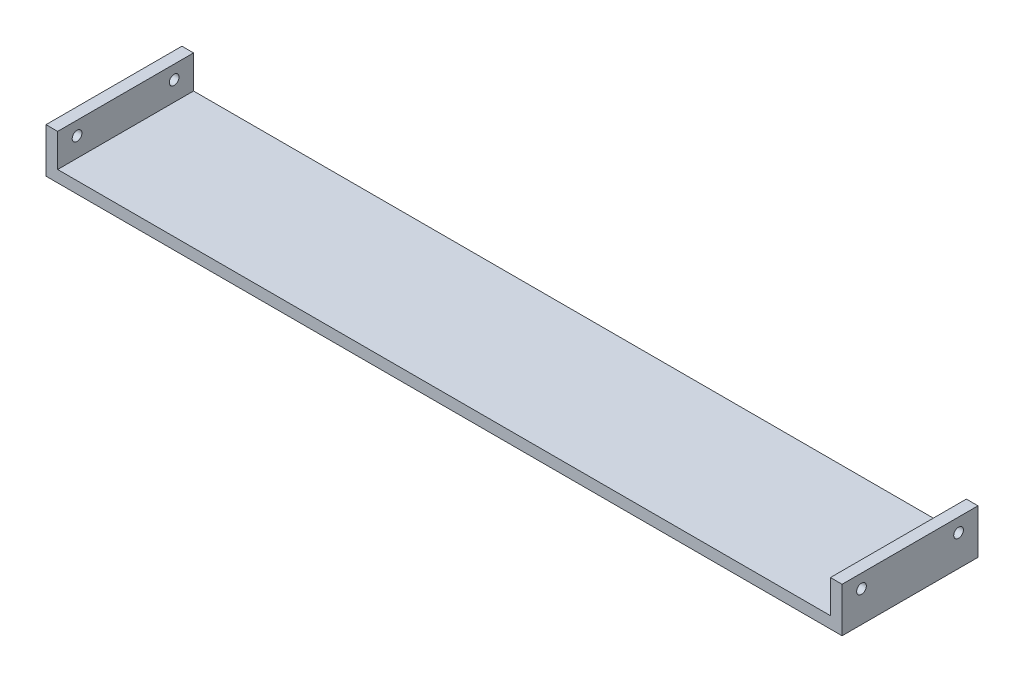
ISO-10303-21;
HEADER;
FILE_DESCRIPTION(('STEP AP214'),'2;1');
FILE_NAME('part.step','',(''),(''),'','','');
FILE_SCHEMA(('AUTOMOTIVE_DESIGN { 1 0 10303 214 1 1 1 1 }'));
ENDSEC;
DATA;
#1=APPLICATION_CONTEXT('core data for automotive mechanical design processes');
#2=APPLICATION_PROTOCOL_DEFINITION('international standard','automotive_design',2000,#1);
#3=PRODUCT_CONTEXT('',#1,'mechanical');
#4=PRODUCT('Part','Part','',(#3));
#5=PRODUCT_RELATED_PRODUCT_CATEGORY('part','',(#4));
#6=PRODUCT_DEFINITION_FORMATION('','',#4);
#7=PRODUCT_DEFINITION_CONTEXT('part definition',#1,'design');
#8=PRODUCT_DEFINITION('design','',#6,#7);
#9=PRODUCT_DEFINITION_SHAPE('','',#8);
#10=(LENGTH_UNIT() NAMED_UNIT(*) SI_UNIT(.MILLI.,.METRE.));
#11=(NAMED_UNIT(*) PLANE_ANGLE_UNIT() SI_UNIT($,.RADIAN.));
#12=(NAMED_UNIT(*) SI_UNIT($,.STERADIAN.) SOLID_ANGLE_UNIT());
#13=UNCERTAINTY_MEASURE_WITH_UNIT(LENGTH_MEASURE(1.E-05),#10,'distance_accuracy_value','');
#14=(GEOMETRIC_REPRESENTATION_CONTEXT(3) GLOBAL_UNCERTAINTY_ASSIGNED_CONTEXT((#13)) GLOBAL_UNIT_ASSIGNED_CONTEXT((#10,
#11,#12)) REPRESENTATION_CONTEXT('',''));
#15=CARTESIAN_POINT('',(0.,0.,0.));
#16=DIRECTION('',(0.,0.,1.));
#17=DIRECTION('',(1.,0.,0.));
#18=AXIS2_PLACEMENT_3D('',#15,#16,#17);
#19=CARTESIAN_POINT('',(0.,6.,0.));
#20=DIRECTION('',(0.,1.,0.));
#21=DIRECTION('',(0.,0.,1.));
#22=AXIS2_PLACEMENT_3D('',#19,#20,#21);
#23=PLANE('',#22);
#24=DIRECTION('',(1.,0.,0.));
#25=VECTOR('',#24,1.);
#26=CARTESIAN_POINT('',(-70.3609605089149,6.,-4.64884917648187));
#27=LINE('',#26,#25);
#28=CARTESIAN_POINT('',(-64.3609605089149,6.,-4.64884917648187));
#29=VERTEX_POINT('',#28);
#30=CARTESIAN_POINT('',(333.639039491085,6.,-4.64884917648187));
#31=VERTEX_POINT('',#30);
#32=EDGE_CURVE('E128',#29,#31,#27,.T.);
#33=ORIENTED_EDGE('',*,*,#32,.T.);
#34=DIRECTION('',(0.,0.,1.));
#35=VECTOR('',#34,1.);
#36=CARTESIAN_POINT('',(333.639039491085,6.,-74.6488491764819));
#37=LINE('',#36,#35);
#38=CARTESIAN_POINT('',(333.639039491085,6.,-74.6488491764819));
#39=VERTEX_POINT('',#38);
#40=EDGE_CURVE('E172',#39,#31,#37,.T.);
#41=ORIENTED_EDGE('',*,*,#40,.F.);
#42=DIRECTION('',(-1.,0.,0.));
#43=VECTOR('',#42,1.);
#44=CARTESIAN_POINT('',(-70.360960508915,6.,-74.6488491764819));
#45=LINE('',#44,#43);
#46=CARTESIAN_POINT('',(-64.3609605089149,6.,-74.6488491764819));
#47=VERTEX_POINT('',#46);
#48=EDGE_CURVE('E132',#39,#47,#45,.T.);
#49=ORIENTED_EDGE('',*,*,#48,.T.);
#50=DIRECTION('',(0.,0.,-1.));
#51=VECTOR('',#50,1.);
#52=CARTESIAN_POINT('',(-64.3609605089149,6.,-4.64884917648187));
#53=LINE('',#52,#51);
#54=EDGE_CURVE('E134',#29,#47,#53,.T.);
#55=ORIENTED_EDGE('',*,*,#54,.F.);
#56=EDGE_LOOP('',(#33,#41,#49,#55));
#57=FACE_BOUND('',#56,.T.);
#58=ADVANCED_FACE('F36',(#57),#23,.T.);
#59=CARTESIAN_POINT('',(-70.360960508915,6.,-74.6488491764819));
#60=DIRECTION('',(1.,0.,0.));
#61=DIRECTION('',(0.,0.,-1.));
#62=AXIS2_PLACEMENT_3D('',#59,#60,#61);
#63=PLANE('',#62);
#64=CARTESIAN_POINT('',(-70.3609605089149,16.,-14.6488491764819));
#65=DIRECTION('',(-1.,0.,0.));
#66=DIRECTION('',(0.,0.,1.));
#67=AXIS2_PLACEMENT_3D('',#64,#65,#66);
#68=CIRCLE('',#67,2.5);
#69=CARTESIAN_POINT('',(-70.3609605089149,16.,-12.1488491764819));
#70=VERTEX_POINT('',#69);
#71=EDGE_CURVE('E185',#70,#70,#68,.T.);
#72=ORIENTED_EDGE('',*,*,#71,.F.);
#73=EDGE_LOOP('',(#72));
#74=FACE_BOUND('',#73,.T.);
#75=CARTESIAN_POINT('',(-70.360960508915,16.,-64.6488491764819));
#76=DIRECTION('',(-1.,0.,0.));
#77=DIRECTION('',(0.,0.,1.));
#78=AXIS2_PLACEMENT_3D('',#75,#76,#77);
#79=CIRCLE('',#78,2.5);
#80=CARTESIAN_POINT('',(-70.360960508915,16.,-62.1488491764819));
#81=VERTEX_POINT('',#80);
#82=EDGE_CURVE('E178',#81,#81,#79,.T.);
#83=ORIENTED_EDGE('',*,*,#82,.F.);
#84=EDGE_LOOP('',(#83));
#85=FACE_BOUND('',#84,.T.);
#86=DIRECTION('',(0.,-1.,0.));
#87=VECTOR('',#86,1.);
#88=CARTESIAN_POINT('',(-70.3609605089149,6.,-4.64884917648187));
#89=LINE('',#88,#87);
#90=CARTESIAN_POINT('',(-70.3609605089149,23.,-4.64884917648187));
#91=VERTEX_POINT('',#90);
#92=CARTESIAN_POINT('',(-70.3609605089149,0.,-4.64884917648187));
#93=VERTEX_POINT('',#92);
#94=EDGE_CURVE('E46',#91,#93,#89,.T.);
#95=ORIENTED_EDGE('',*,*,#94,.F.);
#96=DIRECTION('',(0.,0.,-1.));
#97=VECTOR('',#96,1.);
#98=CARTESIAN_POINT('',(-70.3609605089149,23.,-4.64884917648187));
#99=LINE('',#98,#97);
#100=CARTESIAN_POINT('',(-70.3609605089149,23.,-74.6488491764819));
#101=VERTEX_POINT('',#100);
#102=EDGE_CURVE('E101',#91,#101,#99,.T.);
#103=ORIENTED_EDGE('',*,*,#102,.T.);
#104=DIRECTION('',(0.,-1.,0.));
#105=VECTOR('',#104,1.);
#106=CARTESIAN_POINT('',(-70.360960508915,6.,-74.6488491764819));
#107=LINE('',#106,#105);
#108=CARTESIAN_POINT('',(-70.360960508915,0.,-74.6488491764819));
#109=VERTEX_POINT('',#108);
#110=EDGE_CURVE('E147',#101,#109,#107,.T.);
#111=ORIENTED_EDGE('',*,*,#110,.T.);
#112=DIRECTION('',(0.,0.,1.));
#113=VECTOR('',#112,1.);
#114=CARTESIAN_POINT('',(-70.360960508915,0.,-74.6488491764819));
#115=LINE('',#114,#113);
#116=EDGE_CURVE('E121',#109,#93,#115,.T.);
#117=ORIENTED_EDGE('',*,*,#116,.T.);
#118=EDGE_LOOP('',(#95,#103,#111,#117));
#119=FACE_BOUND('',#118,.T.);
#120=ADVANCED_FACE('F38',(#74,#85,#119),#63,.F.);
#121=CARTESIAN_POINT('',(-70.3609605089149,6.,-4.64884917648187));
#122=DIRECTION('',(0.,0.,-1.));
#123=DIRECTION('',(-1.,0.,0.));
#124=AXIS2_PLACEMENT_3D('',#121,#122,#123);
#125=PLANE('',#124);
#126=DIRECTION('',(0.,-1.,0.));
#127=VECTOR('',#126,1.);
#128=CARTESIAN_POINT('',(339.639039491085,6.,-4.64884917648187));
#129=LINE('',#128,#127);
#130=CARTESIAN_POINT('',(339.639039491085,23.,-4.64884917648187));
#131=VERTEX_POINT('',#130);
#132=CARTESIAN_POINT('',(339.639039491085,0.,-4.64884917648187));
#133=VERTEX_POINT('',#132);
#134=EDGE_CURVE('E122',#131,#133,#129,.T.);
#135=ORIENTED_EDGE('',*,*,#134,.F.);
#136=DIRECTION('',(1.,0.,0.));
#137=VECTOR('',#136,1.);
#138=CARTESIAN_POINT('',(-70.3609605089149,23.,-4.64884917648187));
#139=LINE('',#138,#137);
#140=CARTESIAN_POINT('',(333.639039491085,23.,-4.64884917648187));
#141=VERTEX_POINT('',#140);
#142=EDGE_CURVE('E108',#141,#131,#139,.T.);
#143=ORIENTED_EDGE('',*,*,#142,.F.);
#144=DIRECTION('',(0.,-1.,0.));
#145=VECTOR('',#144,1.);
#146=CARTESIAN_POINT('',(333.639039491085,31.,-4.64884917648187));
#147=LINE('',#146,#145);
#148=EDGE_CURVE('E167',#141,#31,#147,.T.);
#149=ORIENTED_EDGE('',*,*,#148,.T.);
#150=ORIENTED_EDGE('',*,*,#32,.F.);
#151=DIRECTION('',(0.,-1.,0.));
#152=VECTOR('',#151,1.);
#153=CARTESIAN_POINT('',(-64.3609605089149,31.,-4.64884917648187));
#154=LINE('',#153,#152);
#155=CARTESIAN_POINT('',(-64.3609605089149,23.,-4.64884917648187));
#156=VERTEX_POINT('',#155);
#157=EDGE_CURVE('E40',#156,#29,#154,.T.);
#158=ORIENTED_EDGE('',*,*,#157,.F.);
#159=EDGE_CURVE('E54',#91,#156,#139,.T.);
#160=ORIENTED_EDGE('',*,*,#159,.F.);
#161=ORIENTED_EDGE('',*,*,#94,.T.);
#162=DIRECTION('',(1.,0.,0.));
#163=VECTOR('',#162,1.);
#164=CARTESIAN_POINT('',(-70.3609605089149,0.,-4.64884917648187));
#165=LINE('',#164,#163);
#166=EDGE_CURVE('E208',#93,#133,#165,.T.);
#167=ORIENTED_EDGE('',*,*,#166,.T.);
#168=EDGE_LOOP('',(#135,#143,#149,#150,#158,#160,#161,#167));
#169=FACE_BOUND('',#168,.T.);
#170=ADVANCED_FACE('F114',(#169),#125,.F.);
#171=CARTESIAN_POINT('',(339.639039491085,6.,-74.6488491764819));
#172=DIRECTION('',(-1.,0.,0.));
#173=DIRECTION('',(0.,0.,1.));
#174=AXIS2_PLACEMENT_3D('',#171,#172,#173);
#175=PLANE('',#174);
#176=CARTESIAN_POINT('',(339.639039491085,16.,-14.648849176482));
#177=DIRECTION('',(-1.,0.,0.));
#178=DIRECTION('',(0.,0.,1.));
#179=AXIS2_PLACEMENT_3D('',#176,#177,#178);
#180=CIRCLE('',#179,2.5);
#181=CARTESIAN_POINT('',(339.639039491085,16.,-12.148849176482));
#182=VERTEX_POINT('',#181);
#183=EDGE_CURVE('E157',#182,#182,#180,.T.);
#184=ORIENTED_EDGE('',*,*,#183,.T.);
#185=EDGE_LOOP('',(#184));
#186=FACE_BOUND('',#185,.T.);
#187=CARTESIAN_POINT('',(339.639039491085,16.,-64.648849176482));
#188=DIRECTION('',(-1.,0.,0.));
#189=DIRECTION('',(0.,0.,1.));
#190=AXIS2_PLACEMENT_3D('',#187,#188,#189);
#191=CIRCLE('',#190,2.5);
#192=CARTESIAN_POINT('',(339.639039491085,16.,-62.148849176482));
#193=VERTEX_POINT('',#192);
#194=EDGE_CURVE('E153',#193,#193,#191,.T.);
#195=ORIENTED_EDGE('',*,*,#194,.T.);
#196=EDGE_LOOP('',(#195));
#197=FACE_BOUND('',#196,.T.);
#198=DIRECTION('',(0.,-1.,0.));
#199=VECTOR('',#198,1.);
#200=CARTESIAN_POINT('',(339.639039491085,6.,-74.6488491764819));
#201=LINE('',#200,#199);
#202=CARTESIAN_POINT('',(339.639039491085,23.,-74.6488491764819));
#203=VERTEX_POINT('',#202);
#204=CARTESIAN_POINT('',(339.639039491085,0.,-74.6488491764819));
#205=VERTEX_POINT('',#204);
#206=EDGE_CURVE('E124',#203,#205,#201,.T.);
#207=ORIENTED_EDGE('',*,*,#206,.F.);
#208=DIRECTION('',(0.,0.,-1.));
#209=VECTOR('',#208,1.);
#210=CARTESIAN_POINT('',(339.639039491085,23.,-4.64884917648187));
#211=LINE('',#210,#209);
#212=EDGE_CURVE('E109',#131,#203,#211,.T.);
#213=ORIENTED_EDGE('',*,*,#212,.F.);
#214=ORIENTED_EDGE('',*,*,#134,.T.);
#215=DIRECTION('',(0.,0.,-1.));
#216=VECTOR('',#215,1.);
#217=CARTESIAN_POINT('',(339.639039491085,0.,-74.6488491764819));
#218=LINE('',#217,#216);
#219=EDGE_CURVE('E203',#133,#205,#218,.T.);
#220=ORIENTED_EDGE('',*,*,#219,.T.);
#221=EDGE_LOOP('',(#207,#213,#214,#220));
#222=FACE_BOUND('',#221,.T.);
#223=ADVANCED_FACE('F201',(#186,#197,#222),#175,.F.);
#224=CARTESIAN_POINT('',(-70.360960508915,6.,-74.6488491764819));
#225=DIRECTION('',(0.,0.,1.));
#226=DIRECTION('',(1.,0.,0.));
#227=AXIS2_PLACEMENT_3D('',#224,#225,#226);
#228=PLANE('',#227);
#229=ORIENTED_EDGE('',*,*,#110,.F.);
#230=DIRECTION('',(1.,0.,0.));
#231=VECTOR('',#230,1.);
#232=CARTESIAN_POINT('',(-70.3609605089149,23.,-74.6488491764819));
#233=LINE('',#232,#231);
#234=CARTESIAN_POINT('',(-64.3609605089149,23.,-74.6488491764819));
#235=VERTEX_POINT('',#234);
#236=EDGE_CURVE('E104',#101,#235,#233,.T.);
#237=ORIENTED_EDGE('',*,*,#236,.T.);
#238=DIRECTION('',(0.,-1.,0.));
#239=VECTOR('',#238,1.);
#240=CARTESIAN_POINT('',(-64.3609605089149,31.,-74.6488491764819));
#241=LINE('',#240,#239);
#242=EDGE_CURVE('E158',#235,#47,#241,.T.);
#243=ORIENTED_EDGE('',*,*,#242,.T.);
#244=ORIENTED_EDGE('',*,*,#48,.F.);
#245=DIRECTION('',(0.,-1.,0.));
#246=VECTOR('',#245,1.);
#247=CARTESIAN_POINT('',(333.639039491085,31.,-74.6488491764819));
#248=LINE('',#247,#246);
#249=CARTESIAN_POINT('',(333.639039491085,23.,-74.6488491764819));
#250=VERTEX_POINT('',#249);
#251=EDGE_CURVE('E164',#250,#39,#248,.T.);
#252=ORIENTED_EDGE('',*,*,#251,.F.);
#253=EDGE_CURVE('E62',#250,#203,#233,.T.);
#254=ORIENTED_EDGE('',*,*,#253,.T.);
#255=ORIENTED_EDGE('',*,*,#206,.T.);
#256=DIRECTION('',(-1.,0.,0.));
#257=VECTOR('',#256,1.);
#258=CARTESIAN_POINT('',(-70.360960508915,0.,-74.6488491764819));
#259=LINE('',#258,#257);
#260=EDGE_CURVE('E133',#205,#109,#259,.T.);
#261=ORIENTED_EDGE('',*,*,#260,.T.);
#262=EDGE_LOOP('',(#229,#237,#243,#244,#252,#254,#255,#261));
#263=FACE_BOUND('',#262,.T.);
#264=ADVANCED_FACE('F198',(#263),#228,.F.);
#265=CARTESIAN_POINT('',(0.,0.,0.));
#266=DIRECTION('',(0.,1.,0.));
#267=DIRECTION('',(0.,0.,1.));
#268=AXIS2_PLACEMENT_3D('',#265,#266,#267);
#269=PLANE('',#268);
#270=ORIENTED_EDGE('',*,*,#116,.F.);
#271=ORIENTED_EDGE('',*,*,#260,.F.);
#272=ORIENTED_EDGE('',*,*,#219,.F.);
#273=ORIENTED_EDGE('',*,*,#166,.F.);
#274=EDGE_LOOP('',(#270,#271,#272,#273));
#275=FACE_BOUND('',#274,.T.);
#276=ADVANCED_FACE('F210',(#275),#269,.F.);
#277=CARTESIAN_POINT('',(-64.3609605089149,31.,-4.64884917648187));
#278=DIRECTION('',(-1.,0.,0.));
#279=DIRECTION('',(0.,0.,1.));
#280=AXIS2_PLACEMENT_3D('',#277,#278,#279);
#281=PLANE('',#280);
#282=CARTESIAN_POINT('',(-64.3609605089149,16.,-14.6488491764819));
#283=DIRECTION('',(-1.,0.,0.));
#284=DIRECTION('',(0.,0.,1.));
#285=AXIS2_PLACEMENT_3D('',#282,#283,#284);
#286=CIRCLE('',#285,2.5);
#287=CARTESIAN_POINT('',(-64.3609605089149,16.,-12.1488491764819));
#288=VERTEX_POINT('',#287);
#289=EDGE_CURVE('E156',#288,#288,#286,.T.);
#290=ORIENTED_EDGE('',*,*,#289,.T.);
#291=EDGE_LOOP('',(#290));
#292=FACE_BOUND('',#291,.T.);
#293=CARTESIAN_POINT('',(-64.3609605089149,16.,-64.6488491764819));
#294=DIRECTION('',(-1.,0.,0.));
#295=DIRECTION('',(0.,0.,1.));
#296=AXIS2_PLACEMENT_3D('',#293,#294,#295);
#297=CIRCLE('',#296,2.5);
#298=CARTESIAN_POINT('',(-64.3609605089149,16.,-62.1488491764819));
#299=VERTEX_POINT('',#298);
#300=EDGE_CURVE('E152',#299,#299,#297,.T.);
#301=ORIENTED_EDGE('',*,*,#300,.T.);
#302=EDGE_LOOP('',(#301));
#303=FACE_BOUND('',#302,.T.);
#304=ORIENTED_EDGE('',*,*,#242,.F.);
#305=DIRECTION('',(0.,0.,1.));
#306=VECTOR('',#305,1.);
#307=CARTESIAN_POINT('',(-64.3609605089149,23.,-4.64884917648187));
#308=LINE('',#307,#306);
#309=EDGE_CURVE('E188',#235,#156,#308,.T.);
#310=ORIENTED_EDGE('',*,*,#309,.T.);
#311=ORIENTED_EDGE('',*,*,#157,.T.);
#312=ORIENTED_EDGE('',*,*,#54,.T.);
#313=EDGE_LOOP('',(#304,#310,#311,#312));
#314=FACE_BOUND('',#313,.T.);
#315=ADVANCED_FACE('F211',(#292,#303,#314),#281,.F.);
#316=CARTESIAN_POINT('',(333.639039491085,31.,-74.6488491764819));
#317=DIRECTION('',(1.,0.,0.));
#318=DIRECTION('',(0.,0.,-1.));
#319=AXIS2_PLACEMENT_3D('',#316,#317,#318);
#320=PLANE('',#319);
#321=CARTESIAN_POINT('',(333.639039491085,16.,-14.648849176482));
#322=DIRECTION('',(1.,0.,0.));
#323=DIRECTION('',(0.,0.,-1.));
#324=AXIS2_PLACEMENT_3D('',#321,#322,#323);
#325=CIRCLE('',#324,2.5);
#326=CARTESIAN_POINT('',(333.639039491085,16.,-17.148849176482));
#327=VERTEX_POINT('',#326);
#328=EDGE_CURVE('E154',#327,#327,#325,.T.);
#329=ORIENTED_EDGE('',*,*,#328,.T.);
#330=EDGE_LOOP('',(#329));
#331=FACE_BOUND('',#330,.T.);
#332=CARTESIAN_POINT('',(333.639039491085,16.,-64.648849176482));
#333=DIRECTION('',(1.,0.,0.));
#334=DIRECTION('',(0.,0.,-1.));
#335=AXIS2_PLACEMENT_3D('',#332,#333,#334);
#336=CIRCLE('',#335,2.5);
#337=CARTESIAN_POINT('',(333.639039491085,16.,-67.148849176482));
#338=VERTEX_POINT('',#337);
#339=EDGE_CURVE('E149',#338,#338,#336,.T.);
#340=ORIENTED_EDGE('',*,*,#339,.T.);
#341=EDGE_LOOP('',(#340));
#342=FACE_BOUND('',#341,.T.);
#343=ORIENTED_EDGE('',*,*,#148,.F.);
#344=DIRECTION('',(0.,0.,-1.));
#345=VECTOR('',#344,1.);
#346=CARTESIAN_POINT('',(333.639039491085,23.,-74.6488491764819));
#347=LINE('',#346,#345);
#348=EDGE_CURVE('E11',#141,#250,#347,.T.);
#349=ORIENTED_EDGE('',*,*,#348,.T.);
#350=ORIENTED_EDGE('',*,*,#251,.T.);
#351=ORIENTED_EDGE('',*,*,#40,.T.);
#352=EDGE_LOOP('',(#343,#349,#350,#351));
#353=FACE_BOUND('',#352,.T.);
#354=ADVANCED_FACE('F214',(#331,#342,#353),#320,.F.);
#355=CARTESIAN_POINT('',(339.639039491085,16.,-64.648849176482));
#356=DIRECTION('',(-1.,0.,0.));
#357=DIRECTION('',(0.,0.,1.));
#358=AXIS2_PLACEMENT_3D('',#355,#356,#357);
#359=CYLINDRICAL_SURFACE('',#358,2.5);
#360=ORIENTED_EDGE('',*,*,#194,.F.);
#361=EDGE_LOOP('',(#360));
#362=FACE_BOUND('',#361,.T.);
#363=ORIENTED_EDGE('',*,*,#339,.F.);
#364=EDGE_LOOP('',(#363));
#365=FACE_BOUND('',#364,.T.);
#366=ADVANCED_FACE('F216',(#362,#365),#359,.F.);
#367=ORIENTED_EDGE('',*,*,#82,.T.);
#368=EDGE_LOOP('',(#367));
#369=FACE_BOUND('',#368,.T.);
#370=ORIENTED_EDGE('',*,*,#300,.F.);
#371=EDGE_LOOP('',(#370));
#372=FACE_BOUND('',#371,.T.);
#373=ADVANCED_FACE('F223',(#369,#372),#359,.F.);
#374=CARTESIAN_POINT('',(339.639039491085,16.,-14.648849176482));
#375=DIRECTION('',(-1.,0.,0.));
#376=DIRECTION('',(0.,0.,1.));
#377=AXIS2_PLACEMENT_3D('',#374,#375,#376);
#378=CYLINDRICAL_SURFACE('',#377,2.5);
#379=ORIENTED_EDGE('',*,*,#183,.F.);
#380=EDGE_LOOP('',(#379));
#381=FACE_BOUND('',#380,.T.);
#382=ORIENTED_EDGE('',*,*,#328,.F.);
#383=EDGE_LOOP('',(#382));
#384=FACE_BOUND('',#383,.T.);
#385=ADVANCED_FACE('F291',(#381,#384),#378,.F.);
#386=ORIENTED_EDGE('',*,*,#71,.T.);
#387=EDGE_LOOP('',(#386));
#388=FACE_BOUND('',#387,.T.);
#389=ORIENTED_EDGE('',*,*,#289,.F.);
#390=EDGE_LOOP('',(#389));
#391=FACE_BOUND('',#390,.T.);
#392=ADVANCED_FACE('F277',(#388,#391),#378,.F.);
#393=CARTESIAN_POINT('',(-70.3609605089149,23.,-4.64884917648187));
#394=DIRECTION('',(0.,-1.,0.));
#395=DIRECTION('',(0.,0.,-1.));
#396=AXIS2_PLACEMENT_3D('',#393,#394,#395);
#397=PLANE('',#396);
#398=ORIENTED_EDGE('',*,*,#142,.T.);
#399=ORIENTED_EDGE('',*,*,#212,.T.);
#400=ORIENTED_EDGE('',*,*,#253,.F.);
#401=ORIENTED_EDGE('',*,*,#348,.F.);
#402=EDGE_LOOP('',(#398,#399,#400,#401));
#403=FACE_BOUND('',#402,.T.);
#404=ADVANCED_FACE('F194',(#403),#397,.F.);
#405=ORIENTED_EDGE('',*,*,#236,.F.);
#406=ORIENTED_EDGE('',*,*,#102,.F.);
#407=ORIENTED_EDGE('',*,*,#159,.T.);
#408=ORIENTED_EDGE('',*,*,#309,.F.);
#409=EDGE_LOOP('',(#405,#406,#407,#408));
#410=FACE_BOUND('',#409,.T.);
#411=ADVANCED_FACE('F102',(#410),#397,.F.);
#412=CLOSED_SHELL('',(#58,#120,#170,#223,#264,#276,#315,#354,#366,#373,#385,#392,#404,#411));
#413=MANIFOLD_SOLID_BREP('B2',#412);
#414=ADVANCED_BREP_SHAPE_REPRESENTATION('',(#18,#413),#14);
#415=SHAPE_DEFINITION_REPRESENTATION(#9,#414);
ENDSEC;
END-ISO-10303-21;
